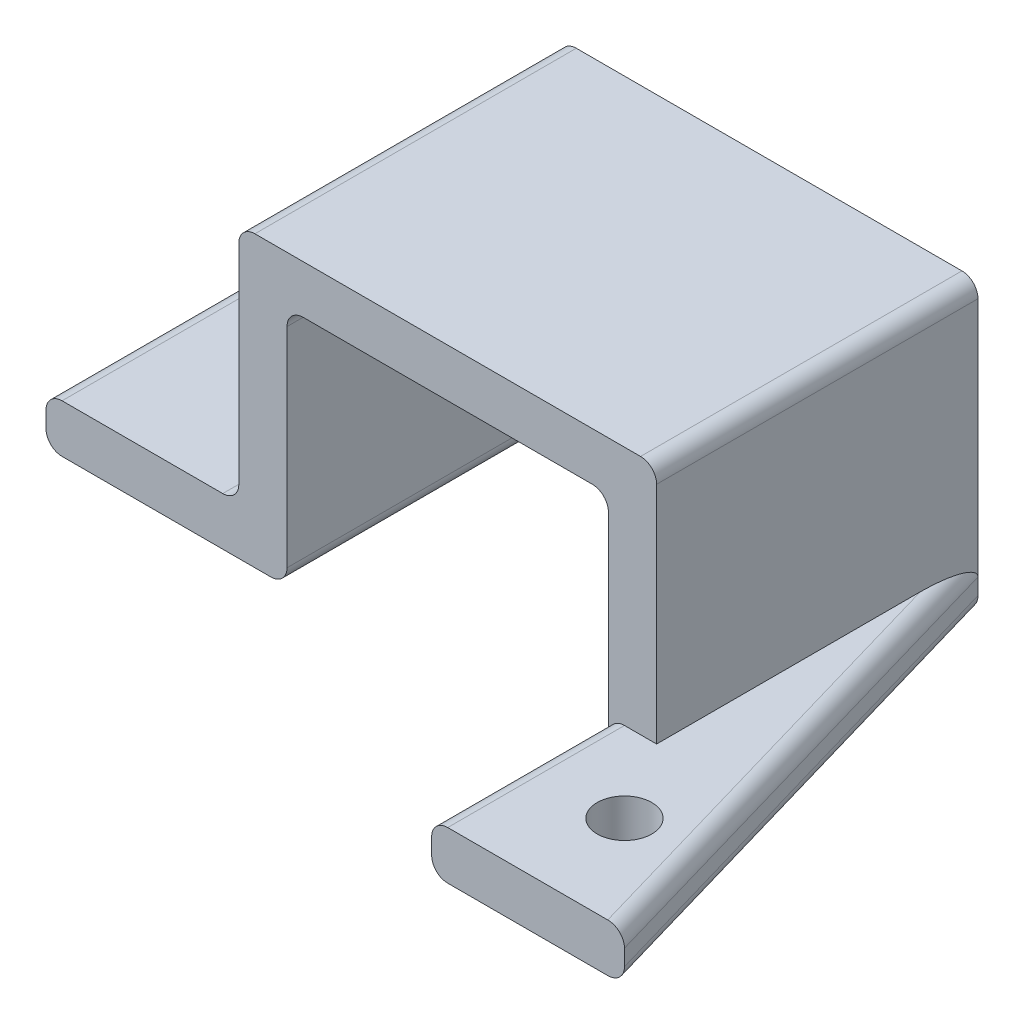
ISO-10303-21;
HEADER;
FILE_DESCRIPTION(('STEP AP214'),'2;1');
FILE_NAME('part.step','',(''),(''),'','','');
FILE_SCHEMA(('AUTOMOTIVE_DESIGN { 1 0 10303 214 1 1 1 1 }'));
ENDSEC;
DATA;
#1=APPLICATION_CONTEXT('core data for automotive mechanical design processes');
#2=APPLICATION_PROTOCOL_DEFINITION('international standard','automotive_design',2000,#1);
#3=PRODUCT_CONTEXT('',#1,'mechanical');
#4=PRODUCT('Part','Part','',(#3));
#5=PRODUCT_RELATED_PRODUCT_CATEGORY('part','',(#4));
#6=PRODUCT_DEFINITION_FORMATION('','',#4);
#7=PRODUCT_DEFINITION_CONTEXT('part definition',#1,'design');
#8=PRODUCT_DEFINITION('design','',#6,#7);
#9=PRODUCT_DEFINITION_SHAPE('','',#8);
#10=(LENGTH_UNIT() NAMED_UNIT(*) SI_UNIT(.MILLI.,.METRE.));
#11=(NAMED_UNIT(*) PLANE_ANGLE_UNIT() SI_UNIT($,.RADIAN.));
#12=(NAMED_UNIT(*) SI_UNIT($,.STERADIAN.) SOLID_ANGLE_UNIT());
#13=UNCERTAINTY_MEASURE_WITH_UNIT(LENGTH_MEASURE(1.E-05),#10,'distance_accuracy_value','');
#14=(GEOMETRIC_REPRESENTATION_CONTEXT(3) GLOBAL_UNCERTAINTY_ASSIGNED_CONTEXT((#13)) GLOBAL_UNIT_ASSIGNED_CONTEXT((#10,
#11,#12)) REPRESENTATION_CONTEXT('',''));
#15=CARTESIAN_POINT('',(0.,0.,0.));
#16=DIRECTION('',(0.,0.,1.));
#17=DIRECTION('',(1.,0.,0.));
#18=AXIS2_PLACEMENT_3D('',#15,#16,#17);
#19=CARTESIAN_POINT('',(0.,18.,-20.));
#20=DIRECTION('',(1.,0.,0.));
#21=DIRECTION('',(0.,1.,0.));
#22=AXIS2_PLACEMENT_3D('',#19,#20,#21);
#23=PLANE('',#22);
#24=DIRECTION('',(0.,-1.,0.));
#25=VECTOR('',#24,1.);
#26=CARTESIAN_POINT('',(0.,18.,0.));
#27=LINE('',#26,#25);
#28=CARTESIAN_POINT('',(0.,17.,0.));
#29=VERTEX_POINT('',#28);
#30=CARTESIAN_POINT('',(0.,4.,0.));
#31=VERTEX_POINT('',#30);
#32=EDGE_CURVE('E233',#29,#31,#27,.T.);
#33=ORIENTED_EDGE('',*,*,#32,.F.);
#34=DIRECTION('',(0.,0.,1.));
#35=VECTOR('',#34,1.);
#36=CARTESIAN_POINT('',(0.,17.,-20.));
#37=LINE('',#36,#35);
#38=CARTESIAN_POINT('',(0.,17.,-20.));
#39=VERTEX_POINT('',#38);
#40=EDGE_CURVE('E306',#39,#29,#37,.T.);
#41=ORIENTED_EDGE('',*,*,#40,.F.);
#42=DIRECTION('',(0.,-1.,0.));
#43=VECTOR('',#42,1.);
#44=CARTESIAN_POINT('',(0.,18.,-20.));
#45=LINE('',#44,#43);
#46=CARTESIAN_POINT('',(0.,4.,-20.));
#47=VERTEX_POINT('',#46);
#48=EDGE_CURVE('E246',#39,#47,#45,.T.);
#49=ORIENTED_EDGE('',*,*,#48,.T.);
#50=DIRECTION('',(0.,0.,1.));
#51=VECTOR('',#50,1.);
#52=CARTESIAN_POINT('',(0.,4.,-20.));
#53=LINE('',#52,#51);
#54=EDGE_CURVE('E309',#31,#47,#53,.F.);
#55=ORIENTED_EDGE('',*,*,#54,.F.);
#56=EDGE_LOOP('',(#33,#41,#49,#55));
#57=FACE_BOUND('',#56,.T.);
#58=ADVANCED_FACE('F43',(#57),#23,.F.);
#59=CARTESIAN_POINT('',(0.,0.,-20.));
#60=DIRECTION('',(0.,1.,0.));
#61=DIRECTION('',(0.,0.,-1.));
#62=AXIS2_PLACEMENT_3D('',#59,#60,#61);
#63=PLANE('',#62);
#64=CARTESIAN_POINT('',(-6.,0.,-10.));
#65=DIRECTION('',(0.,-1.,0.));
#66=DIRECTION('',(0.,0.,-1.));
#67=AXIS2_PLACEMENT_3D('',#64,#65,#66);
#68=CIRCLE('',#67,1.69999999999999);
#69=CARTESIAN_POINT('',(-6.,0.,-11.7));
#70=VERTEX_POINT('',#69);
#71=EDGE_CURVE('E442',#70,#70,#68,.T.);
#72=ORIENTED_EDGE('',*,*,#71,.F.);
#73=EDGE_LOOP('',(#72));
#74=FACE_BOUND('',#73,.T.);
#75=DIRECTION('',(1.,0.,0.));
#76=VECTOR('',#75,1.);
#77=CARTESIAN_POINT('',(0.,0.,0.));
#78=LINE('',#77,#76);
#79=CARTESIAN_POINT('',(-11.,0.,0.));
#80=VERTEX_POINT('',#79);
#81=CARTESIAN_POINT('',(2.,0.,0.));
#82=VERTEX_POINT('',#81);
#83=EDGE_CURVE('E368',#80,#82,#78,.T.);
#84=ORIENTED_EDGE('',*,*,#83,.F.);
#85=DIRECTION('',(0.,0.,-1.));
#86=VECTOR('',#85,1.);
#87=CARTESIAN_POINT('',(-11.,0.,-20.));
#88=LINE('',#87,#86);
#89=CARTESIAN_POINT('',(-11.,0.,-20.));
#90=VERTEX_POINT('',#89);
#91=EDGE_CURVE('E276',#90,#80,#88,.F.);
#92=ORIENTED_EDGE('',*,*,#91,.F.);
#93=DIRECTION('',(1.,0.,0.));
#94=VECTOR('',#93,1.);
#95=CARTESIAN_POINT('',(0.,0.,-20.));
#96=LINE('',#95,#94);
#97=CARTESIAN_POINT('',(2.,0.,-20.));
#98=VERTEX_POINT('',#97);
#99=EDGE_CURVE('E241',#90,#98,#96,.T.);
#100=ORIENTED_EDGE('',*,*,#99,.T.);
#101=DIRECTION('',(0.,0.,1.));
#102=VECTOR('',#101,1.);
#103=CARTESIAN_POINT('',(2.,0.,-20.));
#104=LINE('',#103,#102);
#105=EDGE_CURVE('E279',#82,#98,#104,.F.);
#106=ORIENTED_EDGE('',*,*,#105,.F.);
#107=EDGE_LOOP('',(#84,#92,#100,#106));
#108=FACE_BOUND('',#107,.T.);
#109=ADVANCED_FACE('F472',(#74,#108),#63,.F.);
#110=CARTESIAN_POINT('',(3.,0.,-20.));
#111=DIRECTION('',(-1.,0.,0.));
#112=DIRECTION('',(0.,0.,-1.));
#113=AXIS2_PLACEMENT_3D('',#110,#111,#112);
#114=PLANE('',#113);
#115=DIRECTION('',(0.,1.,0.));
#116=VECTOR('',#115,1.);
#117=CARTESIAN_POINT('',(3.,0.,0.));
#118=LINE('',#117,#116);
#119=CARTESIAN_POINT('',(3.,1.,0.));
#120=VERTEX_POINT('',#119);
#121=CARTESIAN_POINT('',(3.,14.,0.));
#122=VERTEX_POINT('',#121);
#123=EDGE_CURVE('E396',#120,#122,#118,.T.);
#124=ORIENTED_EDGE('',*,*,#123,.F.);
#125=DIRECTION('',(0.,0.,1.));
#126=VECTOR('',#125,1.);
#127=CARTESIAN_POINT('',(3.,1.,-20.));
#128=LINE('',#127,#126);
#129=CARTESIAN_POINT('',(3.,1.,-20.));
#130=VERTEX_POINT('',#129);
#131=EDGE_CURVE('E249',#130,#120,#128,.T.);
#132=ORIENTED_EDGE('',*,*,#131,.F.);
#133=DIRECTION('',(0.,1.,0.));
#134=VECTOR('',#133,1.);
#135=CARTESIAN_POINT('',(3.,0.,-20.));
#136=LINE('',#135,#134);
#137=CARTESIAN_POINT('',(3.,14.,-20.));
#138=VERTEX_POINT('',#137);
#139=EDGE_CURVE('E374',#130,#138,#136,.T.);
#140=ORIENTED_EDGE('',*,*,#139,.T.);
#141=DIRECTION('',(0.,0.,1.));
#142=VECTOR('',#141,1.);
#143=CARTESIAN_POINT('',(3.,14.,-20.));
#144=LINE('',#143,#142);
#145=EDGE_CURVE('E252',#122,#138,#144,.F.);
#146=ORIENTED_EDGE('',*,*,#145,.F.);
#147=EDGE_LOOP('',(#124,#132,#140,#146));
#148=FACE_BOUND('',#147,.T.);
#149=ADVANCED_FACE('F478',(#148),#114,.F.);
#150=CARTESIAN_POINT('',(3.,15.,-20.));
#151=DIRECTION('',(0.,1.,0.));
#152=DIRECTION('',(0.,0.,-1.));
#153=AXIS2_PLACEMENT_3D('',#150,#151,#152);
#154=PLANE('',#153);
#155=DIRECTION('',(1.,0.,0.));
#156=VECTOR('',#155,1.);
#157=CARTESIAN_POINT('',(3.,15.,-20.));
#158=LINE('',#157,#156);
#159=CARTESIAN_POINT('',(4.,15.,-20.));
#160=VERTEX_POINT('',#159);
#161=CARTESIAN_POINT('',(22.,15.,-20.));
#162=VERTEX_POINT('',#161);
#163=EDGE_CURVE('E377',#160,#162,#158,.T.);
#164=ORIENTED_EDGE('',*,*,#163,.T.);
#165=DIRECTION('',(0.,0.,1.));
#166=VECTOR('',#165,1.);
#167=CARTESIAN_POINT('',(22.,15.,-20.));
#168=LINE('',#167,#166);
#169=CARTESIAN_POINT('',(22.,15.,0.));
#170=VERTEX_POINT('',#169);
#171=EDGE_CURVE('E242',#170,#162,#168,.F.);
#172=ORIENTED_EDGE('',*,*,#171,.F.);
#173=DIRECTION('',(1.,0.,0.));
#174=VECTOR('',#173,1.);
#175=CARTESIAN_POINT('',(3.,15.,0.));
#176=LINE('',#175,#174);
#177=CARTESIAN_POINT('',(4.,15.,0.));
#178=VERTEX_POINT('',#177);
#179=EDGE_CURVE('E235',#178,#170,#176,.T.);
#180=ORIENTED_EDGE('',*,*,#179,.F.);
#181=DIRECTION('',(0.,0.,1.));
#182=VECTOR('',#181,1.);
#183=CARTESIAN_POINT('',(4.,15.,0.));
#184=LINE('',#183,#182);
#185=EDGE_CURVE('E245',#160,#178,#184,.T.);
#186=ORIENTED_EDGE('',*,*,#185,.F.);
#187=EDGE_LOOP('',(#164,#172,#180,#186));
#188=FACE_BOUND('',#187,.T.);
#189=ADVANCED_FACE('F401',(#188),#154,.F.);
#190=CARTESIAN_POINT('',(23.,15.,-20.));
#191=DIRECTION('',(1.,0.,0.));
#192=DIRECTION('',(0.,0.,1.));
#193=AXIS2_PLACEMENT_3D('',#190,#191,#192);
#194=PLANE('',#193);
#195=DIRECTION('',(0.,-1.,0.));
#196=VECTOR('',#195,1.);
#197=CARTESIAN_POINT('',(23.,15.,-20.));
#198=LINE('',#197,#196);
#199=CARTESIAN_POINT('',(23.,14.,-20.));
#200=VERTEX_POINT('',#199);
#201=CARTESIAN_POINT('',(23.,1.,-20.));
#202=VERTEX_POINT('',#201);
#203=EDGE_CURVE('E380',#200,#202,#198,.T.);
#204=ORIENTED_EDGE('',*,*,#203,.T.);
#205=DIRECTION('',(0.,0.,1.));
#206=VECTOR('',#205,1.);
#207=CARTESIAN_POINT('',(23.,1.,-20.));
#208=LINE('',#207,#206);
#209=CARTESIAN_POINT('',(23.,1.,11.));
#210=VERTEX_POINT('',#209);
#211=EDGE_CURVE('E255',#210,#202,#208,.F.);
#212=ORIENTED_EDGE('',*,*,#211,.F.);
#213=DIRECTION('',(0.,-1.,0.));
#214=VECTOR('',#213,1.);
#215=CARTESIAN_POINT('',(23.,3.,11.));
#216=LINE('',#215,#214);
#217=CARTESIAN_POINT('',(23.,2.,11.));
#218=VERTEX_POINT('',#217);
#219=EDGE_CURVE('E212',#218,#210,#216,.T.);
#220=ORIENTED_EDGE('',*,*,#219,.F.);
#221=DIRECTION('',(0.,0.,-1.));
#222=VECTOR('',#221,1.);
#223=CARTESIAN_POINT('',(23.,2.,11.));
#224=LINE('',#223,#222);
#225=CARTESIAN_POINT('',(23.,2.,0.));
#226=VERTEX_POINT('',#225);
#227=EDGE_CURVE('E258',#226,#218,#224,.F.);
#228=ORIENTED_EDGE('',*,*,#227,.F.);
#229=DIRECTION('',(0.,-1.,0.));
#230=VECTOR('',#229,1.);
#231=CARTESIAN_POINT('',(23.,15.,0.));
#232=LINE('',#231,#230);
#233=CARTESIAN_POINT('',(23.,14.,0.));
#234=VERTEX_POINT('',#233);
#235=EDGE_CURVE('E230',#234,#226,#232,.T.);
#236=ORIENTED_EDGE('',*,*,#235,.F.);
#237=DIRECTION('',(0.,0.,1.));
#238=VECTOR('',#237,1.);
#239=CARTESIAN_POINT('',(23.,14.,0.));
#240=LINE('',#239,#238);
#241=EDGE_CURVE('E261',#200,#234,#240,.T.);
#242=ORIENTED_EDGE('',*,*,#241,.F.);
#243=EDGE_LOOP('',(#204,#212,#220,#228,#236,#242));
#244=FACE_BOUND('',#243,.T.);
#245=ADVANCED_FACE('F362',(#244),#194,.F.);
#246=CARTESIAN_POINT('',(23.,0.,-20.));
#247=DIRECTION('',(0.,1.,0.));
#248=DIRECTION('',(0.,0.,-1.));
#249=AXIS2_PLACEMENT_3D('',#246,#247,#248);
#250=PLANE('',#249);
#251=CARTESIAN_POINT('',(29.,0.,5.));
#252=DIRECTION('',(0.,-1.,0.));
#253=DIRECTION('',(0.,0.,-1.));
#254=AXIS2_PLACEMENT_3D('',#251,#252,#253);
#255=CIRCLE('',#254,1.7);
#256=CARTESIAN_POINT('',(29.,0.,3.3));
#257=VERTEX_POINT('',#256);
#258=EDGE_CURVE('E448',#257,#257,#255,.T.);
#259=ORIENTED_EDGE('',*,*,#258,.F.);
#260=EDGE_LOOP('',(#259));
#261=FACE_BOUND('',#260,.T.);
#262=DIRECTION('',(1.,0.,0.));
#263=VECTOR('',#262,1.);
#264=CARTESIAN_POINT('',(23.,0.,-20.));
#265=LINE('',#264,#263);
#266=CARTESIAN_POINT('',(24.,0.,-20.));
#267=VERTEX_POINT('',#266);
#268=CARTESIAN_POINT('',(24.9587088779633,0.,-20.));
#269=VERTEX_POINT('',#268);
#270=EDGE_CURVE('E382',#267,#269,#265,.T.);
#271=ORIENTED_EDGE('',*,*,#270,.T.);
#272=DIRECTION('',(0.278810194863956,0.,0.960346226753624));
#273=VECTOR('',#272,1.);
#274=CARTESIAN_POINT('',(24.8064483989661,0.,-20.5244527609902));
#275=LINE('',#274,#273);
#276=CARTESIAN_POINT('',(33.9587088779633,0.,11.));
#277=VERTEX_POINT('',#276);
#278=EDGE_CURVE('E323',#277,#269,#275,.F.);
#279=ORIENTED_EDGE('',*,*,#278,.F.);
#280=DIRECTION('',(-1.,0.,0.));
#281=VECTOR('',#280,1.);
#282=CARTESIAN_POINT('',(35.,0.,11.));
#283=LINE('',#282,#281);
#284=CARTESIAN_POINT('',(24.,0.,11.));
#285=VERTEX_POINT('',#284);
#286=EDGE_CURVE('E222',#277,#285,#283,.T.);
#287=ORIENTED_EDGE('',*,*,#286,.T.);
#288=DIRECTION('',(0.,0.,1.));
#289=VECTOR('',#288,1.);
#290=CARTESIAN_POINT('',(24.,0.,-20.));
#291=LINE('',#290,#289);
#292=EDGE_CURVE('E326',#267,#285,#291,.T.);
#293=ORIENTED_EDGE('',*,*,#292,.F.);
#294=EDGE_LOOP('',(#271,#279,#287,#293));
#295=FACE_BOUND('',#294,.T.);
#296=ADVANCED_FACE('F418',(#261,#295),#250,.F.);
#297=CARTESIAN_POINT('',(26.,0.,-20.));
#298=DIRECTION('',(-1.,0.,0.));
#299=DIRECTION('',(0.,0.,-1.));
#300=AXIS2_PLACEMENT_3D('',#297,#298,#299);
#301=PLANE('',#300);
#302=DIRECTION('',(0.,1.,0.));
#303=VECTOR('',#302,1.);
#304=CARTESIAN_POINT('',(26.,0.,0.));
#305=LINE('',#304,#303);
#306=CARTESIAN_POINT('',(26.,3.,0.));
#307=VERTEX_POINT('',#306);
#308=CARTESIAN_POINT('',(26.,17.,0.));
#309=VERTEX_POINT('',#308);
#310=EDGE_CURVE('E209',#307,#309,#305,.T.);
#311=ORIENTED_EDGE('',*,*,#310,.F.);
#312=DIRECTION('',(0.,0.,-1.));
#313=VECTOR('',#312,1.);
#314=CARTESIAN_POINT('',(26.,3.,-20.));
#315=LINE('',#314,#313);
#316=CARTESIAN_POINT('',(26.,3.,-16.4133305796513));
#317=VERTEX_POINT('',#316);
#318=EDGE_CURVE('E216',#307,#317,#315,.T.);
#319=ORIENTED_EDGE('',*,*,#318,.T.);
#320=CARTESIAN_POINT('',(26.,2.,-16.4133305796513));
#321=DIRECTION('',(1.,0.,0.));
#322=DIRECTION('',(0.,0.,-1.));
#323=AXIS2_PLACEMENT_3D('',#320,#321,#322);
#324=ELLIPSE('',#323,3.58666942034866,1.);
#325=CARTESIAN_POINT('',(26.,2.,-20.));
#326=VERTEX_POINT('',#325);
#327=EDGE_CURVE('E11',#326,#317,#324,.T.);
#328=ORIENTED_EDGE('',*,*,#327,.F.);
#329=DIRECTION('',(0.,1.,0.));
#330=VECTOR('',#329,1.);
#331=CARTESIAN_POINT('',(26.,0.,-20.));
#332=LINE('',#331,#330);
#333=CARTESIAN_POINT('',(26.,17.,-20.));
#334=VERTEX_POINT('',#333);
#335=EDGE_CURVE('E385',#326,#334,#332,.T.);
#336=ORIENTED_EDGE('',*,*,#335,.T.);
#337=DIRECTION('',(0.,0.,1.));
#338=VECTOR('',#337,1.);
#339=CARTESIAN_POINT('',(26.,17.,-20.));
#340=LINE('',#339,#338);
#341=EDGE_CURVE('E228',#309,#334,#340,.F.);
#342=ORIENTED_EDGE('',*,*,#341,.F.);
#343=EDGE_LOOP('',(#311,#319,#328,#336,#342));
#344=FACE_BOUND('',#343,.T.);
#345=ADVANCED_FACE('F225',(#344),#301,.F.);
#346=CARTESIAN_POINT('',(26.,18.,-20.));
#347=DIRECTION('',(0.,-1.,0.));
#348=DIRECTION('',(1.,0.,0.));
#349=AXIS2_PLACEMENT_3D('',#346,#347,#348);
#350=PLANE('',#349);
#351=DIRECTION('',(-1.,0.,0.));
#352=VECTOR('',#351,1.);
#353=CARTESIAN_POINT('',(26.,18.,0.));
#354=LINE('',#353,#352);
#355=CARTESIAN_POINT('',(25.,18.,0.));
#356=VERTEX_POINT('',#355);
#357=CARTESIAN_POINT('',(1.,18.,0.));
#358=VERTEX_POINT('',#357);
#359=EDGE_CURVE('E229',#356,#358,#354,.T.);
#360=ORIENTED_EDGE('',*,*,#359,.F.);
#361=DIRECTION('',(0.,0.,1.));
#362=VECTOR('',#361,1.);
#363=CARTESIAN_POINT('',(25.,18.,-20.));
#364=LINE('',#363,#362);
#365=CARTESIAN_POINT('',(25.,18.,-20.));
#366=VERTEX_POINT('',#365);
#367=EDGE_CURVE('E329',#366,#356,#364,.T.);
#368=ORIENTED_EDGE('',*,*,#367,.F.);
#369=DIRECTION('',(-1.,0.,0.));
#370=VECTOR('',#369,1.);
#371=CARTESIAN_POINT('',(26.,18.,-20.));
#372=LINE('',#371,#370);
#373=CARTESIAN_POINT('',(1.,18.,-20.));
#374=VERTEX_POINT('',#373);
#375=EDGE_CURVE('E389',#366,#374,#372,.T.);
#376=ORIENTED_EDGE('',*,*,#375,.T.);
#377=DIRECTION('',(0.,0.,1.));
#378=VECTOR('',#377,1.);
#379=CARTESIAN_POINT('',(1.,18.,-20.));
#380=LINE('',#379,#378);
#381=EDGE_CURVE('E332',#358,#374,#380,.F.);
#382=ORIENTED_EDGE('',*,*,#381,.F.);
#383=EDGE_LOOP('',(#360,#368,#376,#382));
#384=FACE_BOUND('',#383,.T.);
#385=ADVANCED_FACE('F485',(#384),#350,.F.);
#386=CARTESIAN_POINT('',(0.,0.,-20.));
#387=DIRECTION('',(0.,0.,-1.));
#388=DIRECTION('',(1.,0.,0.));
#389=AXIS2_PLACEMENT_3D('',#386,#387,#388);
#390=PLANE('',#389);
#391=ORIENTED_EDGE('',*,*,#99,.F.);
#392=CARTESIAN_POINT('',(-11.,1.,-20.));
#393=DIRECTION('',(0.,0.,1.));
#394=DIRECTION('',(1.,0.,0.));
#395=AXIS2_PLACEMENT_3D('',#392,#393,#394);
#396=CIRCLE('',#395,1.);
#397=CARTESIAN_POINT('',(-12.,1.,-20.));
#398=VERTEX_POINT('',#397);
#399=EDGE_CURVE('E294',#398,#90,#396,.T.);
#400=ORIENTED_EDGE('',*,*,#399,.F.);
#401=DIRECTION('',(0.,-1.,0.));
#402=VECTOR('',#401,1.);
#403=CARTESIAN_POINT('',(-12.,3.,-20.));
#404=LINE('',#403,#402);
#405=CARTESIAN_POINT('',(-12.,2.,-20.));
#406=VERTEX_POINT('',#405);
#407=EDGE_CURVE('E436',#406,#398,#404,.T.);
#408=ORIENTED_EDGE('',*,*,#407,.F.);
#409=CARTESIAN_POINT('',(-11.,2.,-20.));
#410=DIRECTION('',(0.,0.,1.));
#411=DIRECTION('',(1.,0.,0.));
#412=AXIS2_PLACEMENT_3D('',#409,#410,#411);
#413=CIRCLE('',#412,1.);
#414=CARTESIAN_POINT('',(-11.,3.,-20.));
#415=VERTEX_POINT('',#414);
#416=EDGE_CURVE('E291',#415,#406,#413,.T.);
#417=ORIENTED_EDGE('',*,*,#416,.F.);
#418=DIRECTION('',(1.,0.,0.));
#419=VECTOR('',#418,1.);
#420=CARTESIAN_POINT('',(0.,3.,-20.));
#421=LINE('',#420,#419);
#422=CARTESIAN_POINT('',(-1.,3.,-20.));
#423=VERTEX_POINT('',#422);
#424=EDGE_CURVE('E433',#415,#423,#421,.T.);
#425=ORIENTED_EDGE('',*,*,#424,.T.);
#426=CARTESIAN_POINT('',(-1.,4.,-20.));
#427=DIRECTION('',(0.,0.,1.));
#428=DIRECTION('',(1.,0.,0.));
#429=AXIS2_PLACEMENT_3D('',#426,#427,#428);
#430=CIRCLE('',#429,1.);
#431=EDGE_CURVE('E351',#47,#423,#430,.F.);
#432=ORIENTED_EDGE('',*,*,#431,.F.);
#433=ORIENTED_EDGE('',*,*,#48,.F.);
#434=CARTESIAN_POINT('',(1.,17.,-20.));
#435=DIRECTION('',(0.,0.,1.));
#436=DIRECTION('',(1.,0.,0.));
#437=AXIS2_PLACEMENT_3D('',#434,#435,#436);
#438=CIRCLE('',#437,1.);
#439=EDGE_CURVE('E287',#374,#39,#438,.T.);
#440=ORIENTED_EDGE('',*,*,#439,.F.);
#441=ORIENTED_EDGE('',*,*,#375,.F.);
#442=CARTESIAN_POINT('',(25.,17.,-20.));
#443=DIRECTION('',(0.,0.,1.));
#444=DIRECTION('',(1.,0.,0.));
#445=AXIS2_PLACEMENT_3D('',#442,#443,#444);
#446=CIRCLE('',#445,1.);
#447=EDGE_CURVE('E282',#334,#366,#446,.T.);
#448=ORIENTED_EDGE('',*,*,#447,.F.);
#449=ORIENTED_EDGE('',*,*,#335,.F.);
#450=CARTESIAN_POINT('',(26.,1.,-20.));
#451=VERTEX_POINT('',#450);
#452=EDGE_CURVE('E386',#451,#326,#332,.T.);
#453=ORIENTED_EDGE('',*,*,#452,.F.);
#454=CARTESIAN_POINT('',(24.9587088779633,1.,-20.));
#455=DIRECTION('',(0.,0.,1.));
#456=DIRECTION('',(1.,0.,0.));
#457=AXIS2_PLACEMENT_3D('',#454,#455,#456);
#458=ELLIPSE('',#457,1.04129112203671,1.);
#459=EDGE_CURVE('E284',#269,#451,#458,.T.);
#460=ORIENTED_EDGE('',*,*,#459,.F.);
#461=ORIENTED_EDGE('',*,*,#270,.F.);
#462=CARTESIAN_POINT('',(24.,1.,-20.));
#463=DIRECTION('',(0.,0.,1.));
#464=DIRECTION('',(1.,0.,0.));
#465=AXIS2_PLACEMENT_3D('',#462,#463,#464);
#466=CIRCLE('',#465,1.);
#467=EDGE_CURVE('E289',#202,#267,#466,.T.);
#468=ORIENTED_EDGE('',*,*,#467,.F.);
#469=ORIENTED_EDGE('',*,*,#203,.F.);
#470=CARTESIAN_POINT('',(22.,14.,-20.));
#471=DIRECTION('',(0.,0.,1.));
#472=DIRECTION('',(1.,0.,0.));
#473=AXIS2_PLACEMENT_3D('',#470,#471,#472);
#474=CIRCLE('',#473,1.);
#475=EDGE_CURVE('E347',#162,#200,#474,.F.);
#476=ORIENTED_EDGE('',*,*,#475,.F.);
#477=ORIENTED_EDGE('',*,*,#163,.F.);
#478=CARTESIAN_POINT('',(4.,14.,-20.));
#479=DIRECTION('',(0.,0.,1.));
#480=DIRECTION('',(1.,0.,0.));
#481=AXIS2_PLACEMENT_3D('',#478,#479,#480);
#482=CIRCLE('',#481,1.);
#483=EDGE_CURVE('E343',#138,#160,#482,.F.);
#484=ORIENTED_EDGE('',*,*,#483,.F.);
#485=ORIENTED_EDGE('',*,*,#139,.F.);
#486=CARTESIAN_POINT('',(2.,1.,-20.));
#487=DIRECTION('',(0.,0.,1.));
#488=DIRECTION('',(1.,0.,0.));
#489=AXIS2_PLACEMENT_3D('',#486,#487,#488);
#490=CIRCLE('',#489,1.);
#491=EDGE_CURVE('E296',#98,#130,#490,.T.);
#492=ORIENTED_EDGE('',*,*,#491,.F.);
#493=EDGE_LOOP('',(#391,#400,#408,#417,#425,#432,#433,#440,#441,#448,#449,#453,#460,#461,#468,
#469,#476,#477,#484,#485,#492));
#494=FACE_BOUND('',#493,.T.);
#495=ADVANCED_FACE('F408',(#494),#390,.T.);
#496=CARTESIAN_POINT('',(0.,0.,0.));
#497=DIRECTION('',(0.,0.,-1.));
#498=DIRECTION('',(1.,0.,0.));
#499=AXIS2_PLACEMENT_3D('',#496,#497,#498);
#500=PLANE('',#499);
#501=ORIENTED_EDGE('',*,*,#123,.T.);
#502=CARTESIAN_POINT('',(4.,14.,0.));
#503=DIRECTION('',(0.,0.,1.));
#504=DIRECTION('',(1.,0.,0.));
#505=AXIS2_PLACEMENT_3D('',#502,#503,#504);
#506=CIRCLE('',#505,1.);
#507=EDGE_CURVE('E341',#178,#122,#506,.T.);
#508=ORIENTED_EDGE('',*,*,#507,.F.);
#509=ORIENTED_EDGE('',*,*,#179,.T.);
#510=CARTESIAN_POINT('',(22.,14.,0.));
#511=DIRECTION('',(0.,0.,1.));
#512=DIRECTION('',(1.,0.,0.));
#513=AXIS2_PLACEMENT_3D('',#510,#511,#512);
#514=CIRCLE('',#513,1.);
#515=EDGE_CURVE('E345',#234,#170,#514,.T.);
#516=ORIENTED_EDGE('',*,*,#515,.F.);
#517=ORIENTED_EDGE('',*,*,#235,.T.);
#518=CARTESIAN_POINT('',(24.,2.,0.));
#519=DIRECTION('',(0.,0.,1.));
#520=DIRECTION('',(1.,0.,0.));
#521=AXIS2_PLACEMENT_3D('',#518,#519,#520);
#522=CIRCLE('',#521,1.);
#523=CARTESIAN_POINT('',(24.,3.,0.));
#524=VERTEX_POINT('',#523);
#525=EDGE_CURVE('E52',#524,#226,#522,.T.);
#526=ORIENTED_EDGE('',*,*,#525,.F.);
#527=DIRECTION('',(1.,0.,0.));
#528=VECTOR('',#527,1.);
#529=CARTESIAN_POINT('',(26.,3.,0.));
#530=LINE('',#529,#528);
#531=EDGE_CURVE('E204',#524,#307,#530,.T.);
#532=ORIENTED_EDGE('',*,*,#531,.T.);
#533=ORIENTED_EDGE('',*,*,#310,.T.);
#534=CARTESIAN_POINT('',(25.,17.,0.));
#535=DIRECTION('',(0.,0.,1.));
#536=DIRECTION('',(1.,0.,0.));
#537=AXIS2_PLACEMENT_3D('',#534,#535,#536);
#538=CIRCLE('',#537,1.);
#539=EDGE_CURVE('E264',#356,#309,#538,.F.);
#540=ORIENTED_EDGE('',*,*,#539,.F.);
#541=ORIENTED_EDGE('',*,*,#359,.T.);
#542=CARTESIAN_POINT('',(1.,17.,0.));
#543=DIRECTION('',(0.,0.,1.));
#544=DIRECTION('',(1.,0.,0.));
#545=AXIS2_PLACEMENT_3D('',#542,#543,#544);
#546=CIRCLE('',#545,1.);
#547=EDGE_CURVE('E266',#29,#358,#546,.F.);
#548=ORIENTED_EDGE('',*,*,#547,.F.);
#549=ORIENTED_EDGE('',*,*,#32,.T.);
#550=CARTESIAN_POINT('',(-1.,4.,0.));
#551=DIRECTION('',(0.,0.,1.));
#552=DIRECTION('',(1.,0.,0.));
#553=AXIS2_PLACEMENT_3D('',#550,#551,#552);
#554=CIRCLE('',#553,1.);
#555=CARTESIAN_POINT('',(-1.,3.,0.));
#556=VERTEX_POINT('',#555);
#557=EDGE_CURVE('E349',#556,#31,#554,.T.);
#558=ORIENTED_EDGE('',*,*,#557,.F.);
#559=DIRECTION('',(-1.,0.,0.));
#560=VECTOR('',#559,1.);
#561=CARTESIAN_POINT('',(0.,3.,0.));
#562=LINE('',#561,#560);
#563=CARTESIAN_POINT('',(-11.,3.,0.));
#564=VERTEX_POINT('',#563);
#565=EDGE_CURVE('E417',#556,#564,#562,.T.);
#566=ORIENTED_EDGE('',*,*,#565,.T.);
#567=CARTESIAN_POINT('',(-11.,2.,0.));
#568=DIRECTION('',(0.,0.,1.));
#569=DIRECTION('',(1.,0.,0.));
#570=AXIS2_PLACEMENT_3D('',#567,#568,#569);
#571=CIRCLE('',#570,1.);
#572=CARTESIAN_POINT('',(-12.,2.,0.));
#573=VERTEX_POINT('',#572);
#574=EDGE_CURVE('E268',#573,#564,#571,.F.);
#575=ORIENTED_EDGE('',*,*,#574,.F.);
#576=DIRECTION('',(0.,-1.,0.));
#577=VECTOR('',#576,1.);
#578=CARTESIAN_POINT('',(-12.,3.,0.));
#579=LINE('',#578,#577);
#580=CARTESIAN_POINT('',(-12.,1.,0.));
#581=VERTEX_POINT('',#580);
#582=EDGE_CURVE('E439',#573,#581,#579,.T.);
#583=ORIENTED_EDGE('',*,*,#582,.T.);
#584=CARTESIAN_POINT('',(-11.,1.,0.));
#585=DIRECTION('',(0.,0.,1.));
#586=DIRECTION('',(1.,0.,0.));
#587=AXIS2_PLACEMENT_3D('',#584,#585,#586);
#588=CIRCLE('',#587,1.);
#589=EDGE_CURVE('E271',#80,#581,#588,.F.);
#590=ORIENTED_EDGE('',*,*,#589,.F.);
#591=ORIENTED_EDGE('',*,*,#83,.T.);
#592=CARTESIAN_POINT('',(2.,1.,0.));
#593=DIRECTION('',(0.,0.,1.));
#594=DIRECTION('',(1.,0.,0.));
#595=AXIS2_PLACEMENT_3D('',#592,#593,#594);
#596=CIRCLE('',#595,1.);
#597=EDGE_CURVE('E274',#120,#82,#596,.F.);
#598=ORIENTED_EDGE('',*,*,#597,.F.);
#599=EDGE_LOOP('',(#501,#508,#509,#516,#517,#526,#532,#533,#540,#541,#548,#549,#558,#566,#575,
#583,#590,#591,#598));
#600=FACE_BOUND('',#599,.T.);
#601=ADVANCED_FACE('F207',(#600),#500,.F.);
#602=CARTESIAN_POINT('',(26.,3.,-20.));
#603=DIRECTION('',(-0.960346226753624,0.,0.278810194863956));
#604=DIRECTION('',(-0.278810194863956,0.,-0.960346226753624));
#605=AXIS2_PLACEMENT_3D('',#602,#603,#604);
#606=PLANE('',#605);
#607=DIRECTION('',(0.,-1.,0.));
#608=VECTOR('',#607,1.);
#609=CARTESIAN_POINT('',(35.,3.,11.));
#610=LINE('',#609,#608);
#611=CARTESIAN_POINT('',(35.,2.,11.));
#612=VERTEX_POINT('',#611);
#613=CARTESIAN_POINT('',(35.,1.,11.));
#614=VERTEX_POINT('',#613);
#615=EDGE_CURVE('E365',#612,#614,#610,.T.);
#616=ORIENTED_EDGE('',*,*,#615,.T.);
#617=DIRECTION('',(0.278810194863956,0.,0.960346226753624));
#618=VECTOR('',#617,1.);
#619=CARTESIAN_POINT('',(26.,1.,-20.));
#620=LINE('',#619,#618);
#621=EDGE_CURVE('E335',#451,#614,#620,.T.);
#622=ORIENTED_EDGE('',*,*,#621,.F.);
#623=ORIENTED_EDGE('',*,*,#452,.T.);
#624=DIRECTION('',(0.278810194863956,0.,0.960346226753624));
#625=VECTOR('',#624,1.);
#626=CARTESIAN_POINT('',(26.,2.,-20.));
#627=LINE('',#626,#625);
#628=EDGE_CURVE('E337',#612,#326,#627,.F.);
#629=ORIENTED_EDGE('',*,*,#628,.F.);
#630=EDGE_LOOP('',(#616,#622,#623,#629));
#631=FACE_BOUND('',#630,.T.);
#632=ADVANCED_FACE('F424',(#631),#606,.F.);
#633=CARTESIAN_POINT('',(35.,3.,11.));
#634=DIRECTION('',(0.,0.,-1.));
#635=DIRECTION('',(1.,0.,0.));
#636=AXIS2_PLACEMENT_3D('',#633,#634,#635);
#637=PLANE('',#636);
#638=ORIENTED_EDGE('',*,*,#219,.T.);
#639=CARTESIAN_POINT('',(24.,1.,11.));
#640=DIRECTION('',(0.,0.,1.));
#641=DIRECTION('',(1.,0.,0.));
#642=AXIS2_PLACEMENT_3D('',#639,#640,#641);
#643=CIRCLE('',#642,1.);
#644=EDGE_CURVE('E318',#285,#210,#643,.F.);
#645=ORIENTED_EDGE('',*,*,#644,.F.);
#646=ORIENTED_EDGE('',*,*,#286,.F.);
#647=CARTESIAN_POINT('',(33.9587088779633,1.,11.));
#648=DIRECTION('',(0.,0.,1.));
#649=DIRECTION('',(1.,0.,0.));
#650=AXIS2_PLACEMENT_3D('',#647,#648,#649);
#651=ELLIPSE('',#650,1.04129112203671,1.);
#652=EDGE_CURVE('E59',#614,#277,#651,.F.);
#653=ORIENTED_EDGE('',*,*,#652,.F.);
#654=ORIENTED_EDGE('',*,*,#615,.F.);
#655=CARTESIAN_POINT('',(33.9587088779633,2.,11.));
#656=DIRECTION('',(0.,0.,1.));
#657=DIRECTION('',(-1.,0.,0.));
#658=AXIS2_PLACEMENT_3D('',#655,#656,#657);
#659=ELLIPSE('',#658,1.04129112203671,1.);
#660=CARTESIAN_POINT('',(33.9587088779633,3.,11.));
#661=VERTEX_POINT('',#660);
#662=EDGE_CURVE('E316',#661,#612,#659,.F.);
#663=ORIENTED_EDGE('',*,*,#662,.F.);
#664=DIRECTION('',(-1.,0.,0.));
#665=VECTOR('',#664,1.);
#666=CARTESIAN_POINT('',(35.,3.,11.));
#667=LINE('',#666,#665);
#668=CARTESIAN_POINT('',(24.,3.,11.));
#669=VERTEX_POINT('',#668);
#670=EDGE_CURVE('E213',#661,#669,#667,.T.);
#671=ORIENTED_EDGE('',*,*,#670,.T.);
#672=CARTESIAN_POINT('',(24.,2.,11.));
#673=DIRECTION('',(0.,0.,1.));
#674=DIRECTION('',(1.,0.,0.));
#675=AXIS2_PLACEMENT_3D('',#672,#673,#674);
#676=CIRCLE('',#675,1.);
#677=EDGE_CURVE('E320',#218,#669,#676,.F.);
#678=ORIENTED_EDGE('',*,*,#677,.F.);
#679=EDGE_LOOP('',(#638,#645,#646,#653,#654,#663,#671,#678));
#680=FACE_BOUND('',#679,.T.);
#681=ADVANCED_FACE('F414',(#680),#637,.F.);
#682=CARTESIAN_POINT('',(0.,3.,0.));
#683=DIRECTION('',(0.,1.,0.));
#684=DIRECTION('',(0.,0.,-1.));
#685=AXIS2_PLACEMENT_3D('',#682,#683,#684);
#686=PLANE('',#685);
#687=CARTESIAN_POINT('',(29.,3.,5.));
#688=DIRECTION('',(0.,-1.,0.));
#689=DIRECTION('',(0.,0.,-1.));
#690=AXIS2_PLACEMENT_3D('',#687,#688,#689);
#691=CIRCLE('',#690,1.69999999999999);
#692=CARTESIAN_POINT('',(29.,3.,3.30000000000001));
#693=VERTEX_POINT('',#692);
#694=EDGE_CURVE('E451',#693,#693,#691,.T.);
#695=ORIENTED_EDGE('',*,*,#694,.T.);
#696=EDGE_LOOP('',(#695));
#697=FACE_BOUND('',#696,.T.);
#698=ORIENTED_EDGE('',*,*,#670,.F.);
#699=DIRECTION('',(0.278810194863956,0.,0.960346226753624));
#700=VECTOR('',#699,1.);
#701=CARTESIAN_POINT('',(34.0396537732464,3.,11.2788101948639));
#702=LINE('',#701,#700);
#703=EDGE_CURVE('E219',#317,#661,#702,.T.);
#704=ORIENTED_EDGE('',*,*,#703,.F.);
#705=ORIENTED_EDGE('',*,*,#318,.F.);
#706=ORIENTED_EDGE('',*,*,#531,.F.);
#707=DIRECTION('',(0.,0.,-1.));
#708=VECTOR('',#707,1.);
#709=CARTESIAN_POINT('',(24.,3.,0.));
#710=LINE('',#709,#708);
#711=EDGE_CURVE('E313',#669,#524,#710,.T.);
#712=ORIENTED_EDGE('',*,*,#711,.F.);
#713=EDGE_LOOP('',(#698,#704,#705,#706,#712));
#714=FACE_BOUND('',#713,.T.);
#715=ADVANCED_FACE('F218',(#697,#714),#686,.T.);
#716=CARTESIAN_POINT('',(-12.,3.,-20.));
#717=DIRECTION('',(1.,0.,0.));
#718=DIRECTION('',(0.,0.,1.));
#719=AXIS2_PLACEMENT_3D('',#716,#717,#718);
#720=PLANE('',#719);
#721=ORIENTED_EDGE('',*,*,#582,.F.);
#722=DIRECTION('',(0.,0.,-1.));
#723=VECTOR('',#722,1.);
#724=CARTESIAN_POINT('',(-12.,2.,0.));
#725=LINE('',#724,#723);
#726=EDGE_CURVE('E298',#406,#573,#725,.F.);
#727=ORIENTED_EDGE('',*,*,#726,.F.);
#728=ORIENTED_EDGE('',*,*,#407,.T.);
#729=DIRECTION('',(0.,0.,-1.));
#730=VECTOR('',#729,1.);
#731=CARTESIAN_POINT('',(-12.,1.,-20.));
#732=LINE('',#731,#730);
#733=EDGE_CURVE('E300',#581,#398,#732,.T.);
#734=ORIENTED_EDGE('',*,*,#733,.F.);
#735=EDGE_LOOP('',(#721,#727,#728,#734));
#736=FACE_BOUND('',#735,.T.);
#737=ADVANCED_FACE('F552',(#736),#720,.F.);
#738=CARTESIAN_POINT('',(0.,3.,0.));
#739=DIRECTION('',(0.,1.,0.));
#740=DIRECTION('',(0.,0.,-1.));
#741=AXIS2_PLACEMENT_3D('',#738,#739,#740);
#742=PLANE('',#741);
#743=CARTESIAN_POINT('',(-6.,3.,-10.));
#744=DIRECTION('',(0.,-1.,0.));
#745=DIRECTION('',(0.,0.,-1.));
#746=AXIS2_PLACEMENT_3D('',#743,#744,#745);
#747=CIRCLE('',#746,1.69999999999999);
#748=CARTESIAN_POINT('',(-6.,3.,-11.7));
#749=VERTEX_POINT('',#748);
#750=EDGE_CURVE('E445',#749,#749,#747,.T.);
#751=ORIENTED_EDGE('',*,*,#750,.T.);
#752=EDGE_LOOP('',(#751));
#753=FACE_BOUND('',#752,.T.);
#754=ORIENTED_EDGE('',*,*,#565,.F.);
#755=DIRECTION('',(0.,0.,1.));
#756=VECTOR('',#755,1.);
#757=CARTESIAN_POINT('',(-1.,3.,0.));
#758=LINE('',#757,#756);
#759=EDGE_CURVE('E302',#423,#556,#758,.T.);
#760=ORIENTED_EDGE('',*,*,#759,.F.);
#761=ORIENTED_EDGE('',*,*,#424,.F.);
#762=DIRECTION('',(0.,0.,-1.));
#763=VECTOR('',#762,1.);
#764=CARTESIAN_POINT('',(-11.,3.,-20.));
#765=LINE('',#764,#763);
#766=EDGE_CURVE('E304',#564,#415,#765,.T.);
#767=ORIENTED_EDGE('',*,*,#766,.F.);
#768=EDGE_LOOP('',(#754,#760,#761,#767));
#769=FACE_BOUND('',#768,.T.);
#770=ADVANCED_FACE('F468',(#753,#769),#742,.T.);
#771=CARTESIAN_POINT('',(-6.,3.,-10.));
#772=DIRECTION('',(0.,1.,0.));
#773=DIRECTION('',(0.,0.,-1.));
#774=AXIS2_PLACEMENT_3D('',#771,#772,#773);
#775=CYLINDRICAL_SURFACE('',#774,1.69999999999999);
#776=ORIENTED_EDGE('',*,*,#71,.T.);
#777=EDGE_LOOP('',(#776));
#778=FACE_BOUND('',#777,.T.);
#779=ORIENTED_EDGE('',*,*,#750,.F.);
#780=EDGE_LOOP('',(#779));
#781=FACE_BOUND('',#780,.T.);
#782=ADVANCED_FACE('F459',(#778,#781),#775,.F.);
#783=CARTESIAN_POINT('',(29.,3.,5.));
#784=DIRECTION('',(0.,1.,0.));
#785=DIRECTION('',(0.,0.,-1.));
#786=AXIS2_PLACEMENT_3D('',#783,#784,#785);
#787=CYLINDRICAL_SURFACE('',#786,1.69999999999999);
#788=ORIENTED_EDGE('',*,*,#258,.T.);
#789=EDGE_LOOP('',(#788));
#790=FACE_BOUND('',#789,.T.);
#791=ORIENTED_EDGE('',*,*,#694,.F.);
#792=EDGE_LOOP('',(#791));
#793=FACE_BOUND('',#792,.T.);
#794=ADVANCED_FACE('F456',(#790,#793),#787,.F.);
#795=CARTESIAN_POINT('',(4.,14.,-20.));
#796=DIRECTION('',(0.,0.,-1.));
#797=DIRECTION('',(1.,0.,0.));
#798=AXIS2_PLACEMENT_3D('',#795,#796,#797);
#799=CYLINDRICAL_SURFACE('',#798,1.);
#800=ORIENTED_EDGE('',*,*,#483,.T.);
#801=ORIENTED_EDGE('',*,*,#185,.T.);
#802=ORIENTED_EDGE('',*,*,#507,.T.);
#803=ORIENTED_EDGE('',*,*,#145,.T.);
#804=EDGE_LOOP('',(#800,#801,#802,#803));
#805=FACE_BOUND('',#804,.T.);
#806=ADVANCED_FACE('F458',(#805),#799,.F.);
#807=CARTESIAN_POINT('',(22.,14.,-20.));
#808=DIRECTION('',(0.,0.,-1.));
#809=DIRECTION('',(1.,0.,0.));
#810=AXIS2_PLACEMENT_3D('',#807,#808,#809);
#811=CYLINDRICAL_SURFACE('',#810,1.);
#812=ORIENTED_EDGE('',*,*,#475,.T.);
#813=ORIENTED_EDGE('',*,*,#241,.T.);
#814=ORIENTED_EDGE('',*,*,#515,.T.);
#815=ORIENTED_EDGE('',*,*,#171,.T.);
#816=EDGE_LOOP('',(#812,#813,#814,#815));
#817=FACE_BOUND('',#816,.T.);
#818=ADVANCED_FACE('F404',(#817),#811,.F.);
#819=CARTESIAN_POINT('',(2.,1.,-20.));
#820=DIRECTION('',(0.,0.,1.));
#821=DIRECTION('',(-1.,0.,0.));
#822=AXIS2_PLACEMENT_3D('',#819,#820,#821);
#823=CYLINDRICAL_SURFACE('',#822,1.);
#824=ORIENTED_EDGE('',*,*,#491,.T.);
#825=ORIENTED_EDGE('',*,*,#131,.T.);
#826=ORIENTED_EDGE('',*,*,#597,.T.);
#827=ORIENTED_EDGE('',*,*,#105,.T.);
#828=EDGE_LOOP('',(#824,#825,#826,#827));
#829=FACE_BOUND('',#828,.T.);
#830=ADVANCED_FACE('F503',(#829),#823,.T.);
#831=CARTESIAN_POINT('',(-11.,1.,-20.));
#832=DIRECTION('',(0.,0.,-1.));
#833=DIRECTION('',(1.,0.,0.));
#834=AXIS2_PLACEMENT_3D('',#831,#832,#833);
#835=CYLINDRICAL_SURFACE('',#834,1.);
#836=ORIENTED_EDGE('',*,*,#589,.T.);
#837=ORIENTED_EDGE('',*,*,#733,.T.);
#838=ORIENTED_EDGE('',*,*,#399,.T.);
#839=ORIENTED_EDGE('',*,*,#91,.T.);
#840=EDGE_LOOP('',(#836,#837,#838,#839));
#841=FACE_BOUND('',#840,.T.);
#842=ADVANCED_FACE('F506',(#841),#835,.T.);
#843=CARTESIAN_POINT('',(-11.,2.,0.));
#844=DIRECTION('',(0.,0.,1.));
#845=DIRECTION('',(-1.,0.,0.));
#846=AXIS2_PLACEMENT_3D('',#843,#844,#845);
#847=CYLINDRICAL_SURFACE('',#846,1.);
#848=ORIENTED_EDGE('',*,*,#574,.T.);
#849=ORIENTED_EDGE('',*,*,#766,.T.);
#850=ORIENTED_EDGE('',*,*,#416,.T.);
#851=ORIENTED_EDGE('',*,*,#726,.T.);
#852=EDGE_LOOP('',(#848,#849,#850,#851));
#853=FACE_BOUND('',#852,.T.);
#854=ADVANCED_FACE('F510',(#853),#847,.T.);
#855=CARTESIAN_POINT('',(-1.,4.,0.));
#856=DIRECTION('',(0.,0.,1.));
#857=DIRECTION('',(-1.,0.,0.));
#858=AXIS2_PLACEMENT_3D('',#855,#856,#857);
#859=CYLINDRICAL_SURFACE('',#858,1.);
#860=ORIENTED_EDGE('',*,*,#431,.T.);
#861=ORIENTED_EDGE('',*,*,#759,.T.);
#862=ORIENTED_EDGE('',*,*,#557,.T.);
#863=ORIENTED_EDGE('',*,*,#54,.T.);
#864=EDGE_LOOP('',(#860,#861,#862,#863));
#865=FACE_BOUND('',#864,.T.);
#866=ADVANCED_FACE('F514',(#865),#859,.F.);
#867=CARTESIAN_POINT('',(24.,2.,0.));
#868=DIRECTION('',(0.,0.,1.));
#869=DIRECTION('',(-1.,0.,0.));
#870=AXIS2_PLACEMENT_3D('',#867,#868,#869);
#871=CYLINDRICAL_SURFACE('',#870,1.);
#872=ORIENTED_EDGE('',*,*,#677,.T.);
#873=ORIENTED_EDGE('',*,*,#711,.T.);
#874=ORIENTED_EDGE('',*,*,#525,.T.);
#875=ORIENTED_EDGE('',*,*,#227,.T.);
#876=EDGE_LOOP('',(#872,#873,#874,#875));
#877=FACE_BOUND('',#876,.T.);
#878=ADVANCED_FACE('F354',(#877),#871,.T.);
#879=CARTESIAN_POINT('',(24.,1.,-20.));
#880=DIRECTION('',(0.,0.,1.));
#881=DIRECTION('',(-1.,0.,0.));
#882=AXIS2_PLACEMENT_3D('',#879,#880,#881);
#883=CYLINDRICAL_SURFACE('',#882,1.);
#884=ORIENTED_EDGE('',*,*,#467,.T.);
#885=ORIENTED_EDGE('',*,*,#292,.T.);
#886=ORIENTED_EDGE('',*,*,#644,.T.);
#887=ORIENTED_EDGE('',*,*,#211,.T.);
#888=EDGE_LOOP('',(#884,#885,#886,#887));
#889=FACE_BOUND('',#888,.T.);
#890=ADVANCED_FACE('F412',(#889),#883,.T.);
#891=CARTESIAN_POINT('',(1.,17.,-20.));
#892=DIRECTION('',(0.,0.,1.));
#893=DIRECTION('',(-1.,0.,0.));
#894=AXIS2_PLACEMENT_3D('',#891,#892,#893);
#895=CYLINDRICAL_SURFACE('',#894,1.);
#896=ORIENTED_EDGE('',*,*,#439,.T.);
#897=ORIENTED_EDGE('',*,*,#40,.T.);
#898=ORIENTED_EDGE('',*,*,#547,.T.);
#899=ORIENTED_EDGE('',*,*,#381,.T.);
#900=EDGE_LOOP('',(#896,#897,#898,#899));
#901=FACE_BOUND('',#900,.T.);
#902=ADVANCED_FACE('F523',(#901),#895,.T.);
#903=CARTESIAN_POINT('',(28.3736269018452,2.,-8.23750458440668));
#904=DIRECTION('',(-0.278810194863956,0.,-0.960346226753624));
#905=DIRECTION('',(0.960346226753624,0.,-0.278810194863956));
#906=AXIS2_PLACEMENT_3D('',#903,#904,#905);
#907=CYLINDRICAL_SURFACE('',#906,1.);
#908=ORIENTED_EDGE('',*,*,#327,.T.);
#909=ORIENTED_EDGE('',*,*,#703,.T.);
#910=ORIENTED_EDGE('',*,*,#662,.T.);
#911=ORIENTED_EDGE('',*,*,#628,.T.);
#912=EDGE_LOOP('',(#908,#909,#910,#911));
#913=FACE_BOUND('',#912,.T.);
#914=ADVANCED_FACE('F428',(#913),#907,.T.);
#915=CARTESIAN_POINT('',(25.0396537732464,1.,-19.721189805136));
#916=DIRECTION('',(0.278810194863956,0.,0.960346226753624));
#917=DIRECTION('',(-0.960346226753624,0.,0.278810194863956));
#918=AXIS2_PLACEMENT_3D('',#915,#916,#917);
#919=CYLINDRICAL_SURFACE('',#918,1.);
#920=ORIENTED_EDGE('',*,*,#459,.T.);
#921=ORIENTED_EDGE('',*,*,#621,.T.);
#922=ORIENTED_EDGE('',*,*,#652,.T.);
#923=ORIENTED_EDGE('',*,*,#278,.T.);
#924=EDGE_LOOP('',(#920,#921,#922,#923));
#925=FACE_BOUND('',#924,.T.);
#926=ADVANCED_FACE('F420',(#925),#919,.T.);
#927=CARTESIAN_POINT('',(25.,17.,-20.));
#928=DIRECTION('',(0.,0.,1.));
#929=DIRECTION('',(-1.,0.,0.));
#930=AXIS2_PLACEMENT_3D('',#927,#928,#929);
#931=CYLINDRICAL_SURFACE('',#930,1.);
#932=ORIENTED_EDGE('',*,*,#447,.T.);
#933=ORIENTED_EDGE('',*,*,#367,.T.);
#934=ORIENTED_EDGE('',*,*,#539,.T.);
#935=ORIENTED_EDGE('',*,*,#341,.T.);
#936=EDGE_LOOP('',(#932,#933,#934,#935));
#937=FACE_BOUND('',#936,.T.);
#938=ADVANCED_FACE('F45',(#937),#931,.T.);
#939=CLOSED_SHELL('',(#58,#109,#149,#189,#245,#296,#345,#385,#495,#601,#632,#681,#715,#737,#770,
#782,#794,#806,#818,#830,#842,#854,#866,#878,#890,#902,#914,#926,#938));
#940=MANIFOLD_SOLID_BREP('B2',#939);
#941=ADVANCED_BREP_SHAPE_REPRESENTATION('',(#18,#940),#14);
#942=SHAPE_DEFINITION_REPRESENTATION(#9,#941);
ENDSEC;
END-ISO-10303-21;
